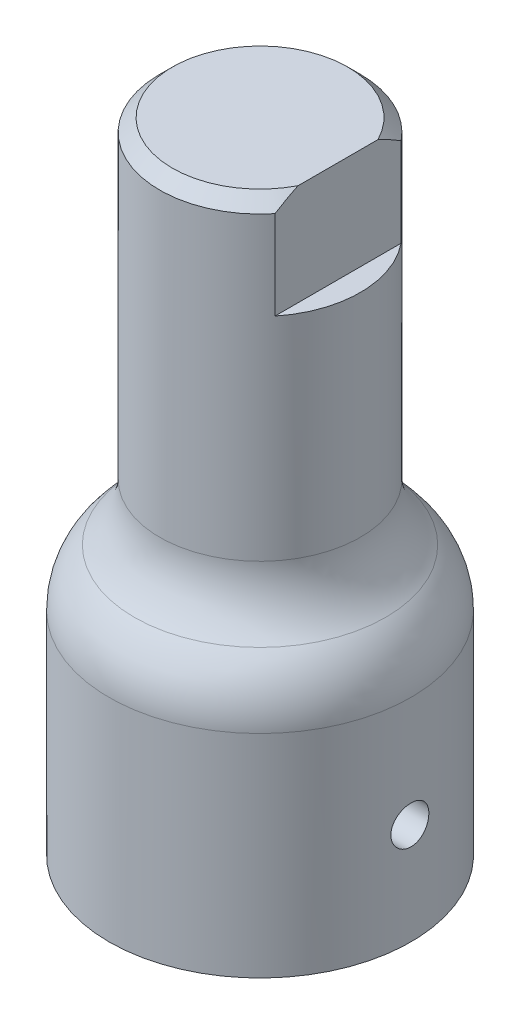
ISO-10303-21;
HEADER;
FILE_DESCRIPTION(('STEP AP214'),'2;1');
FILE_NAME('part.step','',(''),(''),'','','');
FILE_SCHEMA(('AUTOMOTIVE_DESIGN { 1 0 10303 214 1 1 1 1 }'));
ENDSEC;
DATA;
#1=APPLICATION_CONTEXT('core data for automotive mechanical design processes');
#2=APPLICATION_PROTOCOL_DEFINITION('international standard','automotive_design',2000,#1);
#3=PRODUCT_CONTEXT('',#1,'mechanical');
#4=PRODUCT('Part','Part','',(#3));
#5=PRODUCT_RELATED_PRODUCT_CATEGORY('part','',(#4));
#6=PRODUCT_DEFINITION_FORMATION('','',#4);
#7=PRODUCT_DEFINITION_CONTEXT('part definition',#1,'design');
#8=PRODUCT_DEFINITION('design','',#6,#7);
#9=PRODUCT_DEFINITION_SHAPE('','',#8);
#10=(LENGTH_UNIT() NAMED_UNIT(*) SI_UNIT(.MILLI.,.METRE.));
#11=(NAMED_UNIT(*) PLANE_ANGLE_UNIT() SI_UNIT($,.RADIAN.));
#12=(NAMED_UNIT(*) SI_UNIT($,.STERADIAN.) SOLID_ANGLE_UNIT());
#13=UNCERTAINTY_MEASURE_WITH_UNIT(LENGTH_MEASURE(1.E-05),#10,'distance_accuracy_value','');
#14=(GEOMETRIC_REPRESENTATION_CONTEXT(3) GLOBAL_UNCERTAINTY_ASSIGNED_CONTEXT((#13)) GLOBAL_UNIT_ASSIGNED_CONTEXT((#10,
#11,#12)) REPRESENTATION_CONTEXT('',''));
#15=CARTESIAN_POINT('',(0.,0.,0.));
#16=DIRECTION('',(0.,0.,1.));
#17=DIRECTION('',(1.,0.,0.));
#18=AXIS2_PLACEMENT_3D('',#15,#16,#17);
#19=CARTESIAN_POINT('',(0.,40.,0.));
#20=DIRECTION('',(0.,-1.,0.));
#21=DIRECTION('',(0.,0.,-1.));
#22=AXIS2_PLACEMENT_3D('',#19,#20,#21);
#23=CYLINDRICAL_SURFACE('',#22,6.2865);
#24=CARTESIAN_POINT('',(0.,20.3651280605346,0.));
#25=DIRECTION('',(0.,-1.,0.));
#26=DIRECTION('',(0.,0.,-1.));
#27=AXIS2_PLACEMENT_3D('',#24,#25,#26);
#28=CIRCLE('',#27,6.2865);
#29=CARTESIAN_POINT('',(0.,20.3651280605346,-6.2865));
#30=VERTEX_POINT('',#29);
#31=EDGE_CURVE('E167',#30,#30,#28,.F.);
#32=ORIENTED_EDGE('',*,*,#31,.T.);
#33=EDGE_LOOP('',(#32));
#34=FACE_BOUND('',#33,.T.);
#35=DIRECTION('',(0.,1.,0.));
#36=VECTOR('',#35,1.);
#37=CARTESIAN_POINT('',(4.8895,33.65,3.95131269327043));
#38=LINE('',#37,#36);
#39=CARTESIAN_POINT('',(4.8895,33.65,3.95131269327043));
#40=VERTEX_POINT('',#39);
#41=CARTESIAN_POINT('',(4.8895,39.20625,3.95131269327043));
#42=VERTEX_POINT('',#41);
#43=EDGE_CURVE('E88',#40,#42,#38,.T.);
#44=ORIENTED_EDGE('',*,*,#43,.T.);
#45=CARTESIAN_POINT('',(0.,39.20625,0.));
#46=DIRECTION('',(0.,1.,0.));
#47=DIRECTION('',(0.,0.,1.));
#48=AXIS2_PLACEMENT_3D('',#45,#46,#47);
#49=CIRCLE('',#48,6.2865);
#50=CARTESIAN_POINT('',(4.8895,39.20625,-3.95131269327043));
#51=VERTEX_POINT('',#50);
#52=EDGE_CURVE('E11',#42,#51,#49,.F.);
#53=ORIENTED_EDGE('',*,*,#52,.T.);
#54=DIRECTION('',(0.,1.,0.));
#55=VECTOR('',#54,1.);
#56=CARTESIAN_POINT('',(4.8895,33.65,-3.95131269327043));
#57=LINE('',#56,#55);
#58=CARTESIAN_POINT('',(4.8895,33.65,-3.95131269327043));
#59=VERTEX_POINT('',#58);
#60=EDGE_CURVE('E86',#59,#51,#57,.T.);
#61=ORIENTED_EDGE('',*,*,#60,.F.);
#62=CARTESIAN_POINT('',(0.,33.65,0.));
#63=DIRECTION('',(0.,1.,0.));
#64=DIRECTION('',(0.,0.,1.));
#65=AXIS2_PLACEMENT_3D('',#62,#63,#64);
#66=CIRCLE('',#65,6.2865);
#67=EDGE_CURVE('E91',#40,#59,#66,.T.);
#68=ORIENTED_EDGE('',*,*,#67,.F.);
#69=EDGE_LOOP('',(#44,#53,#61,#68));
#70=FACE_BOUND('',#69,.T.);
#71=ADVANCED_FACE('F39',(#34,#70),#23,.T.);
#72=CARTESIAN_POINT('',(0.,40.,0.));
#73=DIRECTION('',(0.,1.,0.));
#74=DIRECTION('',(0.,0.,1.));
#75=AXIS2_PLACEMENT_3D('',#72,#73,#74);
#76=PLANE('',#75);
#77=DIRECTION('',(0.,0.,-1.));
#78=VECTOR('',#77,1.);
#79=CARTESIAN_POINT('',(4.8895,40.,3.95131269327043));
#80=LINE('',#79,#78);
#81=CARTESIAN_POINT('',(4.8895,40.,2.50261709266517));
#82=VERTEX_POINT('',#81);
#83=CARTESIAN_POINT('',(4.8895,40.,-2.50261709266517));
#84=VERTEX_POINT('',#83);
#85=EDGE_CURVE('E94',#82,#84,#80,.T.);
#86=ORIENTED_EDGE('',*,*,#85,.T.);
#87=CARTESIAN_POINT('',(0.,40.,0.));
#88=DIRECTION('',(0.,1.,0.));
#89=DIRECTION('',(0.,0.,1.));
#90=AXIS2_PLACEMENT_3D('',#87,#88,#89);
#91=CIRCLE('',#90,5.49274999999999);
#92=EDGE_CURVE('E170',#84,#82,#91,.T.);
#93=ORIENTED_EDGE('',*,*,#92,.T.);
#94=EDGE_LOOP('',(#86,#93));
#95=FACE_BOUND('',#94,.T.);
#96=ADVANCED_FACE('F144',(#95),#76,.T.);
#97=CARTESIAN_POINT('',(0.,0.,0.));
#98=DIRECTION('',(0.,1.,0.));
#99=DIRECTION('',(0.,0.,1.));
#100=AXIS2_PLACEMENT_3D('',#97,#98,#99);
#101=PLANE('',#100);
#102=CARTESIAN_POINT('',(0.,0.,0.));
#103=DIRECTION('',(0.,1.,0.));
#104=DIRECTION('',(0.,0.,1.));
#105=AXIS2_PLACEMENT_3D('',#102,#103,#104);
#106=CIRCLE('',#105,9.4615);
#107=CARTESIAN_POINT('',(0.,0.,9.4615));
#108=VERTEX_POINT('',#107);
#109=EDGE_CURVE('E172',#108,#108,#106,.T.);
#110=ORIENTED_EDGE('',*,*,#109,.F.);
#111=EDGE_LOOP('',(#110));
#112=FACE_BOUND('',#111,.T.);
#113=CARTESIAN_POINT('',(0.,0.,0.));
#114=DIRECTION('',(0.,1.,0.));
#115=DIRECTION('',(0.,0.,1.));
#116=AXIS2_PLACEMENT_3D('',#113,#114,#115);
#117=CIRCLE('',#116,6.477);
#118=CARTESIAN_POINT('',(4.8895,0.,-4.24786049088244));
#119=VERTEX_POINT('',#118);
#120=CARTESIAN_POINT('',(4.8895,0.,4.24786049088244));
#121=VERTEX_POINT('',#120);
#122=EDGE_CURVE('E111',#119,#121,#117,.T.);
#123=ORIENTED_EDGE('',*,*,#122,.T.);
#124=DIRECTION('',(0.,0.,-1.));
#125=VECTOR('',#124,1.);
#126=CARTESIAN_POINT('',(4.8895,0.,4.24786049088244));
#127=LINE('',#126,#125);
#128=EDGE_CURVE('E253',#121,#119,#127,.T.);
#129=ORIENTED_EDGE('',*,*,#128,.T.);
#130=EDGE_LOOP('',(#123,#129));
#131=FACE_BOUND('',#130,.T.);
#132=ADVANCED_FACE('F141',(#112,#131),#101,.F.);
#133=CARTESIAN_POINT('',(0.,15.875,0.));
#134=DIRECTION('',(0.,-1.,0.));
#135=DIRECTION('',(0.,0.,-1.));
#136=AXIS2_PLACEMENT_3D('',#133,#134,#135);
#137=CYLINDRICAL_SURFACE('',#136,9.4615);
#138=CARTESIAN_POINT('',(9.4615,5.159375,0.));
#139=CARTESIAN_POINT('',(9.46149906578877,5.15937782694142,0.0665955923247563));
#140=CARTESIAN_POINT('',(9.46078946782667,5.16498120665974,0.133232707915061));
#141=CARTESIAN_POINT('',(9.45802699792556,5.18724558952168,0.264652401247792));
#142=CARTESIAN_POINT('',(9.4559727263353,5.20391811463623,0.329432973124758));
#143=CARTESIAN_POINT('',(9.45075231645352,5.24782157800281,0.455218004663156));
#144=CARTESIAN_POINT('',(9.44758692953626,5.27504538241046,0.516224983447316));
#145=CARTESIAN_POINT('',(9.44049627423047,5.33926296341818,0.632792808415883));
#146=CARTESIAN_POINT('',(9.43657113545646,5.37625507392569,0.688354581126615));
#147=CARTESIAN_POINT('',(9.42837468755259,5.4591797056671,0.792776138359194));
#148=CARTESIAN_POINT('',(9.42410175245587,5.50515581551811,0.841601183591291));
#149=CARTESIAN_POINT('',(9.41570439674951,5.60464976321746,0.930864123574371));
#150=CARTESIAN_POINT('',(9.41157998374697,5.65816798667429,0.971301589228939));
#151=CARTESIAN_POINT('',(9.40393064960859,5.77145295266594,1.04277106448273));
#152=CARTESIAN_POINT('',(9.40040782302818,5.83124040216769,1.07377049533973));
#153=CARTESIAN_POINT('',(9.3943819882871,5.95522437218779,1.12527587844151));
#154=CARTESIAN_POINT('',(9.39187894094402,6.01942072319453,1.14578223386377));
#155=CARTESIAN_POINT('',(9.38819160562376,6.15003951190106,1.17561373565146));
#156=CARTESIAN_POINT('',(9.38700039891481,6.21644834892568,1.18499756315806));
#157=CARTESIAN_POINT('',(9.38605044652213,6.34990810239078,1.19249922220742));
#158=CARTESIAN_POINT('',(9.3862916424835,6.41695899256344,1.19061751269878));
#159=CARTESIAN_POINT('',(9.38817291201105,6.54939039165244,1.17568967645467));
#160=CARTESIAN_POINT('',(9.3898048833839,6.61477832081451,1.16270821173111));
#161=CARTESIAN_POINT('',(9.394271182951,6.74244022848938,1.12605025979061));
#162=CARTESIAN_POINT('',(9.39710553580586,6.80471414310507,1.10237355321572));
#163=CARTESIAN_POINT('',(9.40366641559032,6.92458104462984,1.0449277797332));
#164=CARTESIAN_POINT('',(9.40739541878263,6.98216043443739,1.01113063533419));
#165=CARTESIAN_POINT('',(9.41532352183911,7.09085481570547,0.934423446518939));
#166=CARTESIAN_POINT('',(9.41952264348924,7.1419695073488,0.891512979695758));
#167=CARTESIAN_POINT('',(9.42795385525478,7.23665883506219,0.797438962837913));
#168=CARTESIAN_POINT('',(9.43218597018336,7.28017811934494,0.746219681941315));
#169=CARTESIAN_POINT('',(9.44017878609475,7.35801022410089,0.637173793477446));
#170=CARTESIAN_POINT('',(9.44393948596542,7.39232302285506,0.579347170323247));
#171=CARTESIAN_POINT('',(9.45056812141535,7.45076827028881,0.458685233833948));
#172=CARTESIAN_POINT('',(9.45343575079842,7.47489722836414,0.395848211898781));
#173=CARTESIAN_POINT('',(9.45795236933385,7.51224579118798,0.266970293169451));
#174=CARTESIAN_POINT('',(9.45960141631083,7.52546591358998,0.200929548557988));
#175=CARTESIAN_POINT('',(9.46148754558157,7.54054973669,0.0679974107655114));
#176=CARTESIAN_POINT('',(9.46173410734242,7.5424896826492,0.00111479835103478));
#177=CARTESIAN_POINT('',(9.46081308588319,7.53515933315302,-0.132022094410299));
#178=CARTESIAN_POINT('',(9.45964553319375,7.52588927972088,-0.198276388291393));
#179=CARTESIAN_POINT('',(9.45603338012747,7.49646541607601,-0.328050768944093));
#180=CARTESIAN_POINT('',(9.45359304917654,7.47634798487956,-0.391579232915874));
#181=CARTESIAN_POINT('',(9.44770853871787,7.4258382647186,-0.514360767640468));
#182=CARTESIAN_POINT('',(9.44426432470781,7.39544562260121,-0.573613691360558));
#183=CARTESIAN_POINT('',(9.43673237182855,7.32506391810072,-0.686502525005907));
#184=CARTESIAN_POINT('',(9.43264136593917,7.28502556505349,-0.740107482434251));
#185=CARTESIAN_POINT('',(9.42428361830394,7.19655867974053,-0.839863764528427));
#186=CARTESIAN_POINT('',(9.42001686949018,7.14812980977955,-0.886014789049421));
#187=CARTESIAN_POINT('',(9.41175925397741,7.04392064311545,-0.969823876583035));
#188=CARTESIAN_POINT('',(9.40777012181949,6.98809952746204,-1.00743138069409));
#189=CARTESIAN_POINT('',(9.40054799614114,6.87088838625857,-1.07273654001839));
#190=CARTESIAN_POINT('',(9.39731498729147,6.80949847364238,-1.10043439614064));
#191=CARTESIAN_POINT('',(9.39198299312714,6.6830551255491,-1.14505227442555));
#192=CARTESIAN_POINT('',(9.38988101692357,6.61801185963079,-1.1620007435839));
#193=CARTESIAN_POINT('',(9.38704051798563,6.48597437961496,-1.18473031920196));
#194=CARTESIAN_POINT('',(9.38630193089877,6.41898025775023,-1.19051195274123));
#195=CARTESIAN_POINT('',(9.3862737265623,6.28544580767404,-1.19073397960456));
#196=CARTESIAN_POINT('',(9.38697396098104,6.21890559971965,-1.18525380496281));
#197=CARTESIAN_POINT('',(9.3897226747703,6.08770006120807,-1.1632760450682));
#198=CARTESIAN_POINT('',(9.39177115422474,6.02303473076759,-1.14677845912951));
#199=CARTESIAN_POINT('',(9.39698239403539,5.89742536810433,-1.10325911953931));
#200=CARTESIAN_POINT('',(9.40014474357377,5.83647997360405,-1.07624124559597));
#201=CARTESIAN_POINT('',(9.40722807845511,5.7199750894039,-1.01245608517965));
#202=CARTESIAN_POINT('',(9.41114907380932,5.66441567079292,-0.975688670047477));
#203=CARTESIAN_POINT('',(9.41934102991676,5.55985390036275,-0.893153609705072));
#204=CARTESIAN_POINT('',(9.42361417821985,5.51089843696963,-0.847326775522093));
#205=CARTESIAN_POINT('',(9.43200968256653,5.4213420362932,-0.748097249030615));
#206=CARTESIAN_POINT('',(9.43613200283729,5.38074307054622,-0.694692773949497));
#207=CARTESIAN_POINT('',(9.44377893757703,5.30891871660101,-0.581587724289265));
#208=CARTESIAN_POINT('',(9.44730118802571,5.27773004538194,-0.521863684955646));
#209=CARTESIAN_POINT('',(9.45332718449254,5.22586939486203,-0.398014654424663));
#210=CARTESIAN_POINT('',(9.45583203502016,5.20518600467484,-0.333894524608731));
#211=CARTESIAN_POINT('',(9.45893817341265,5.1798660047843,-0.224536692470697));
#212=CARTESIAN_POINT('',(9.45989417026485,5.17219294320163,-0.179988163888808));
#213=CARTESIAN_POINT('',(9.46117539793985,5.16194650146807,-0.0902994518704707));
#214=CARTESIAN_POINT('',(9.46150063349989,5.15937308301699,-0.0451592728800958));
#215=CARTESIAN_POINT('',(9.4615,5.159375,0.));
#216=B_SPLINE_CURVE_WITH_KNOTS('',3,(#138,#139,#140,#141,#142,#143,#144,#145,#146,#147,#148,
#149,#150,#151,#152,#153,#154,#155,#156,#157,#158,#159,#160,#161,#162,#163,#164,#165,#166,#167,
#168,#169,#170,#171,#172,#173,#174,#175,#176,#177,#178,#179,#180,#181,#182,#183,#184,#185,#186,
#187,#188,#189,#190,#191,#192,#193,#194,#195,#196,#197,#198,#199,#200,#201,#202,#203,#204,#205,
#206,#207,#208,#209,#210,#211,#212,#213,#214,#215),.UNSPECIFIED.,.T.,.F.,(4,2,2,2,2,2,2,2,2,2,2,
2,2,2,2,2,2,2,2,2,2,2,2,2,2,2,2,2,2,2,2,2,2,2,2,2,2,2,4),(0.,0.19962182239255,0.399451759359204,
0.599146823977694,0.798807850370998,0.999462787838104,1.20012798799058,1.40147820111376,
1.60282067713724,1.80309609759855,2.00336335906138,2.20247184374355,2.40158441229899,
2.60125458616584,2.8009340168635,3.0020128186625,3.2030920948225,3.40424023687542,
3.60537883336104,3.80515629374004,4.00492944101226,4.20403673571639,4.40315087431576,
4.60330493593609,4.80346705507982,5.00478450910919,5.20609788138105,5.40687625365724,
5.60764514887407,5.80700283758339,6.00636053870286,6.20564478952492,6.40493167031972,
6.6055663772965,6.80624836560705,7.00770353745833,7.20893941724696,7.34430639485888,
7.47967235581148),.UNSPECIFIED.);
#217=CARTESIAN_POINT('',(9.4615,5.159375,0.));
#218=VERTEX_POINT('',#217);
#219=EDGE_CURVE('E103',#218,#218,#216,.T.);
#220=ORIENTED_EDGE('',*,*,#219,.T.);
#221=EDGE_LOOP('',(#220));
#222=FACE_BOUND('',#221,.T.);
#223=CARTESIAN_POINT('',(0.,13.2656122319727,0.));
#224=DIRECTION('',(0.,-1.,0.));
#225=DIRECTION('',(0.,0.,-1.));
#226=AXIS2_PLACEMENT_3D('',#223,#224,#225);
#227=CIRCLE('',#226,9.4615);
#228=CARTESIAN_POINT('',(0.,13.2656122319727,-9.4615));
#229=VERTEX_POINT('',#228);
#230=EDGE_CURVE('E163',#229,#229,#227,.T.);
#231=ORIENTED_EDGE('',*,*,#230,.T.);
#232=EDGE_LOOP('',(#231));
#233=FACE_BOUND('',#232,.T.);
#234=ORIENTED_EDGE('',*,*,#109,.T.);
#235=EDGE_LOOP('',(#234));
#236=FACE_BOUND('',#235,.T.);
#237=ADVANCED_FACE('F114',(#222,#233,#236),#137,.T.);
#238=CARTESIAN_POINT('',(0.,12.7,0.));
#239=DIRECTION('',(0.,-1.,0.));
#240=DIRECTION('',(0.,0.,-1.));
#241=AXIS2_PLACEMENT_3D('',#238,#239,#240);
#242=CYLINDRICAL_SURFACE('',#241,6.477);
#243=ORIENTED_EDGE('',*,*,#122,.F.);
#244=DIRECTION('',(0.,-1.,0.));
#245=VECTOR('',#244,1.);
#246=CARTESIAN_POINT('',(4.8895,12.7,-4.24786049088244));
#247=LINE('',#246,#245);
#248=CARTESIAN_POINT('',(4.8895,12.7,-4.24786049088244));
#249=VERTEX_POINT('',#248);
#250=EDGE_CURVE('E263',#249,#119,#247,.T.);
#251=ORIENTED_EDGE('',*,*,#250,.F.);
#252=CARTESIAN_POINT('',(0.,12.7,0.));
#253=DIRECTION('',(0.,1.,0.));
#254=DIRECTION('',(0.,0.,1.));
#255=AXIS2_PLACEMENT_3D('',#252,#253,#254);
#256=CIRCLE('',#255,6.477);
#257=CARTESIAN_POINT('',(4.8895,12.7,4.24786049088244));
#258=VERTEX_POINT('',#257);
#259=EDGE_CURVE('E112',#249,#258,#256,.T.);
#260=ORIENTED_EDGE('',*,*,#259,.T.);
#261=DIRECTION('',(0.,-1.,0.));
#262=VECTOR('',#261,1.);
#263=CARTESIAN_POINT('',(4.8895,12.7,4.24786049088244));
#264=LINE('',#263,#262);
#265=EDGE_CURVE('E266',#258,#121,#264,.T.);
#266=ORIENTED_EDGE('',*,*,#265,.T.);
#267=EDGE_LOOP('',(#243,#251,#260,#266));
#268=FACE_BOUND('',#267,.T.);
#269=ADVANCED_FACE('F134',(#268),#242,.F.);
#270=CARTESIAN_POINT('',(4.8895,12.7,4.24786049088244));
#271=DIRECTION('',(-1.,0.,0.));
#272=DIRECTION('',(0.,0.,1.));
#273=AXIS2_PLACEMENT_3D('',#270,#271,#272);
#274=PLANE('',#273);
#275=CARTESIAN_POINT('',(4.8895,6.35,0.));
#276=DIRECTION('',(-1.,0.,0.));
#277=DIRECTION('',(0.,0.,1.));
#278=AXIS2_PLACEMENT_3D('',#275,#276,#277);
#279=CIRCLE('',#278,1.190625);
#280=CARTESIAN_POINT('',(4.8895,6.35,1.190625));
#281=VERTEX_POINT('',#280);
#282=EDGE_CURVE('E97',#281,#281,#279,.T.);
#283=ORIENTED_EDGE('',*,*,#282,.F.);
#284=EDGE_LOOP('',(#283));
#285=FACE_BOUND('',#284,.T.);
#286=ORIENTED_EDGE('',*,*,#128,.F.);
#287=ORIENTED_EDGE('',*,*,#265,.F.);
#288=DIRECTION('',(0.,0.,-1.));
#289=VECTOR('',#288,1.);
#290=CARTESIAN_POINT('',(4.8895,12.7,4.24786049088244));
#291=LINE('',#290,#289);
#292=EDGE_CURVE('E260',#258,#249,#291,.T.);
#293=ORIENTED_EDGE('',*,*,#292,.T.);
#294=ORIENTED_EDGE('',*,*,#250,.T.);
#295=EDGE_LOOP('',(#286,#287,#293,#294));
#296=FACE_BOUND('',#295,.T.);
#297=ADVANCED_FACE('F131',(#285,#296),#274,.T.);
#298=CARTESIAN_POINT('',(0.,12.7,0.));
#299=DIRECTION('',(0.,1.,0.));
#300=DIRECTION('',(0.,0.,1.));
#301=AXIS2_PLACEMENT_3D('',#298,#299,#300);
#302=PLANE('',#301);
#303=ORIENTED_EDGE('',*,*,#259,.F.);
#304=ORIENTED_EDGE('',*,*,#292,.F.);
#305=EDGE_LOOP('',(#303,#304));
#306=FACE_BOUND('',#305,.T.);
#307=ADVANCED_FACE('F127',(#306),#302,.F.);
#308=CARTESIAN_POINT('',(0.,20.3651280605346,0.));
#309=DIRECTION('',(0.,-1.,0.));
#310=DIRECTION('',(0.,0.,-1.));
#311=AXIS2_PLACEMENT_3D('',#308,#309,#310);
#312=TOROIDAL_SURFACE('',#311,11.049,4.7625);
#313=CARTESIAN_POINT('',(0.,16.8153701462537,0.));
#314=DIRECTION('',(0.,1.,0.));
#315=DIRECTION('',(0.,0.,1.));
#316=AXIS2_PLACEMENT_3D('',#313,#314,#315);
#317=CIRCLE('',#316,7.874);
#318=CARTESIAN_POINT('',(0.,16.8153701462537,7.874));
#319=VERTEX_POINT('',#318);
#320=EDGE_CURVE('E166',#319,#319,#317,.T.);
#321=ORIENTED_EDGE('',*,*,#320,.T.);
#322=EDGE_LOOP('',(#321));
#323=FACE_BOUND('',#322,.T.);
#324=ORIENTED_EDGE('',*,*,#31,.F.);
#325=EDGE_LOOP('',(#324));
#326=FACE_BOUND('',#325,.T.);
#327=ADVANCED_FACE('F130',(#323,#326),#312,.F.);
#328=CARTESIAN_POINT('',(0.,13.2656122319727,0.));
#329=DIRECTION('',(0.,-1.,0.));
#330=DIRECTION('',(0.,0.,-1.));
#331=AXIS2_PLACEMENT_3D('',#328,#329,#330);
#332=DEGENERATE_TOROIDAL_SURFACE('',#331,4.699,4.7625,.T.);
#333=ORIENTED_EDGE('',*,*,#230,.F.);
#334=EDGE_LOOP('',(#333));
#335=FACE_BOUND('',#334,.T.);
#336=ORIENTED_EDGE('',*,*,#320,.F.);
#337=EDGE_LOOP('',(#336));
#338=FACE_BOUND('',#337,.T.);
#339=ADVANCED_FACE('F123',(#335,#338),#332,.T.);
#340=CARTESIAN_POINT('',(9.4615,6.35,0.));
#341=DIRECTION('',(-1.,0.,0.));
#342=DIRECTION('',(0.,0.,1.));
#343=AXIS2_PLACEMENT_3D('',#340,#341,#342);
#344=CYLINDRICAL_SURFACE('',#343,1.190625);
#345=ORIENTED_EDGE('',*,*,#282,.T.);
#346=EDGE_LOOP('',(#345));
#347=FACE_BOUND('',#346,.T.);
#348=ORIENTED_EDGE('',*,*,#219,.F.);
#349=EDGE_LOOP('',(#348));
#350=FACE_BOUND('',#349,.T.);
#351=ADVANCED_FACE('F118',(#347,#350),#344,.F.);
#352=CARTESIAN_POINT('',(4.8895,33.65,3.95131269327043));
#353=DIRECTION('',(1.,0.,0.));
#354=DIRECTION('',(0.,0.,-1.));
#355=AXIS2_PLACEMENT_3D('',#352,#353,#354);
#356=PLANE('',#355);
#357=ORIENTED_EDGE('',*,*,#85,.F.);
#358=CARTESIAN_POINT('',(4.8895,40.,2.50261709266517));
#359=CARTESIAN_POINT('',(4.8895,39.9428169864129,2.62807233363838));
#360=CARTESIAN_POINT('',(4.8895,39.8828658388279,2.75222812932706));
#361=CARTESIAN_POINT('',(4.8895,39.7582936489579,2.9980084333871));
#362=CARTESIAN_POINT('',(4.8895,39.6936778207006,3.11963557811033));
#363=CARTESIAN_POINT('',(4.8895,39.5605287906818,3.36067333211539));
#364=CARTESIAN_POINT('',(4.8895,39.4919965088834,3.48008445327511));
#365=CARTESIAN_POINT('',(4.8895,39.351519404013,3.7170633465092));
#366=CARTESIAN_POINT('',(4.8895,39.2795709081006,3.83462894514068));
#367=CARTESIAN_POINT('',(4.8895,39.20625,3.95131269327043));
#368=B_SPLINE_CURVE_WITH_KNOTS('',3,(#358,#359,#360,#361,#362,#363,#364,#365,#366,#367),
.UNSPECIFIED.,.F.,.F.,(4,2,2,2,4),(0.,0.413535374650093,0.826615464012299,1.23959891780472,
1.6530369027104),.UNSPECIFIED.);
#369=EDGE_CURVE('E48',#82,#42,#368,.T.);
#370=ORIENTED_EDGE('',*,*,#369,.T.);
#371=ORIENTED_EDGE('',*,*,#43,.F.);
#372=DIRECTION('',(0.,0.,-1.));
#373=VECTOR('',#372,1.);
#374=CARTESIAN_POINT('',(4.8895,33.65,3.95131269327043));
#375=LINE('',#374,#373);
#376=EDGE_CURVE('E83',#40,#59,#375,.T.);
#377=ORIENTED_EDGE('',*,*,#376,.T.);
#378=ORIENTED_EDGE('',*,*,#60,.T.);
#379=CARTESIAN_POINT('',(4.8895,39.20625,-3.95131269327043));
#380=CARTESIAN_POINT('',(4.8895,39.2795709081006,-3.83462894514068));
#381=CARTESIAN_POINT('',(4.8895,39.351519404013,-3.7170633465092));
#382=CARTESIAN_POINT('',(4.8895,39.4919965088834,-3.48008445327511));
#383=CARTESIAN_POINT('',(4.8895,39.5605287906818,-3.36067333211539));
#384=CARTESIAN_POINT('',(4.8895,39.6936778207006,-3.11963557811033));
#385=CARTESIAN_POINT('',(4.8895,39.7582936489579,-2.9980084333871));
#386=CARTESIAN_POINT('',(4.8895,39.8828658388279,-2.75222812932706));
#387=CARTESIAN_POINT('',(4.8895,39.9428169864129,-2.62807233363838));
#388=CARTESIAN_POINT('',(4.8895,40.,-2.50261709266517));
#389=B_SPLINE_CURVE_WITH_KNOTS('',3,(#379,#380,#381,#382,#383,#384,#385,#386,#387,#388),
.UNSPECIFIED.,.F.,.F.,(4,2,2,2,4),(0.,0.41343798490568,0.826421438698102,1.23950152806031,
1.6530369027104),.UNSPECIFIED.);
#390=EDGE_CURVE('E178',#51,#84,#389,.T.);
#391=ORIENTED_EDGE('',*,*,#390,.T.);
#392=EDGE_LOOP('',(#357,#370,#371,#377,#378,#391));
#393=FACE_BOUND('',#392,.T.);
#394=ADVANCED_FACE('F85',(#393),#356,.T.);
#395=CARTESIAN_POINT('',(0.,33.65,0.));
#396=DIRECTION('',(0.,1.,0.));
#397=DIRECTION('',(0.,0.,1.));
#398=AXIS2_PLACEMENT_3D('',#395,#396,#397);
#399=PLANE('',#398);
#400=ORIENTED_EDGE('',*,*,#67,.T.);
#401=ORIENTED_EDGE('',*,*,#376,.F.);
#402=EDGE_LOOP('',(#400,#401));
#403=FACE_BOUND('',#402,.T.);
#404=ADVANCED_FACE('F93',(#403),#399,.T.);
#405=CARTESIAN_POINT('',(0.,40.,0.));
#406=DIRECTION('',(0.,-1.,0.));
#407=DIRECTION('',(0.,0.,-1.));
#408=AXIS2_PLACEMENT_3D('',#405,#406,#407);
#409=CONICAL_SURFACE('',#408,5.49274999999999,0.785398163397455);
#410=ORIENTED_EDGE('',*,*,#390,.F.);
#411=ORIENTED_EDGE('',*,*,#52,.F.);
#412=ORIENTED_EDGE('',*,*,#369,.F.);
#413=ORIENTED_EDGE('',*,*,#92,.F.);
#414=EDGE_LOOP('',(#410,#411,#412,#413));
#415=FACE_BOUND('',#414,.T.);
#416=ADVANCED_FACE('F41',(#415),#409,.T.);
#417=CLOSED_SHELL('',(#71,#96,#132,#237,#269,#297,#307,#327,#339,#351,#394,#404,#416));
#418=MANIFOLD_SOLID_BREP('B2',#417);
#419=ADVANCED_BREP_SHAPE_REPRESENTATION('',(#18,#418),#14);
#420=SHAPE_DEFINITION_REPRESENTATION(#9,#419);
ENDSEC;
END-ISO-10303-21;
